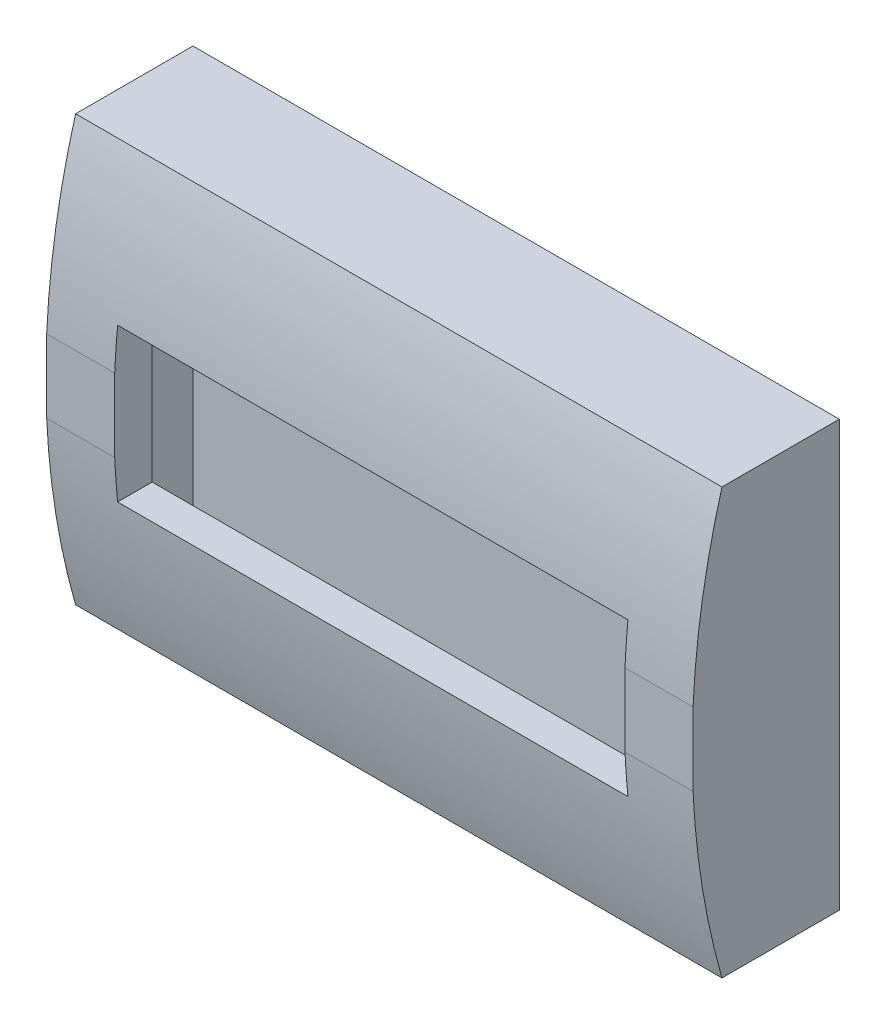
ISO-10303-21;
HEADER;
FILE_DESCRIPTION(('STEP AP214'),'2;1');
FILE_NAME('part.step','',(''),(''),'','','');
FILE_SCHEMA(('AUTOMOTIVE_DESIGN { 1 0 10303 214 1 1 1 1 }'));
ENDSEC;
DATA;
#1=APPLICATION_CONTEXT('core data for automotive mechanical design processes');
#2=APPLICATION_PROTOCOL_DEFINITION('international standard','automotive_design',2000,#1);
#3=PRODUCT_CONTEXT('',#1,'mechanical');
#4=PRODUCT('Part','Part','',(#3));
#5=PRODUCT_RELATED_PRODUCT_CATEGORY('part','',(#4));
#6=PRODUCT_DEFINITION_FORMATION('','',#4);
#7=PRODUCT_DEFINITION_CONTEXT('part definition',#1,'design');
#8=PRODUCT_DEFINITION('design','',#6,#7);
#9=PRODUCT_DEFINITION_SHAPE('','',#8);
#10=(LENGTH_UNIT() NAMED_UNIT(*) SI_UNIT(.MILLI.,.METRE.));
#11=(NAMED_UNIT(*) PLANE_ANGLE_UNIT() SI_UNIT($,.RADIAN.));
#12=(NAMED_UNIT(*) SI_UNIT($,.STERADIAN.) SOLID_ANGLE_UNIT());
#13=UNCERTAINTY_MEASURE_WITH_UNIT(LENGTH_MEASURE(1.E-05),#10,'distance_accuracy_value','');
#14=(GEOMETRIC_REPRESENTATION_CONTEXT(3) GLOBAL_UNCERTAINTY_ASSIGNED_CONTEXT((#13)) GLOBAL_UNIT_ASSIGNED_CONTEXT((#10,
#11,#12)) REPRESENTATION_CONTEXT('',''));
#15=CARTESIAN_POINT('',(0.,0.,0.));
#16=DIRECTION('',(0.,0.,1.));
#17=DIRECTION('',(1.,0.,0.));
#18=AXIS2_PLACEMENT_3D('',#15,#16,#17);
#19=CARTESIAN_POINT('',(150.,-45.,45.));
#20=DIRECTION('',(1.,0.,0.));
#21=DIRECTION('',(0.,0.,-1.));
#22=AXIS2_PLACEMENT_3D('',#19,#20,#21);
#23=PLANE('',#22);
#24=DIRECTION('',(0.,0.,1.));
#25=VECTOR('',#24,1.);
#26=CARTESIAN_POINT('',(150.,-45.,45.));
#27=LINE('',#26,#25);
#28=CARTESIAN_POINT('',(150.,-45.,64.));
#29=VERTEX_POINT('',#28);
#30=CARTESIAN_POINT('',(150.,-45.,84.277301057347));
#31=VERTEX_POINT('',#30);
#32=EDGE_CURVE('E215',#29,#31,#27,.T.);
#33=ORIENTED_EDGE('',*,*,#32,.T.);
#34=CARTESIAN_POINT('',(150.,0.,-368.466147398303));
#35=DIRECTION('',(1.,0.,0.));
#36=DIRECTION('',(0.,0.,-1.));
#37=AXIS2_PLACEMENT_3D('',#34,#35,#36);
#38=CIRCLE('',#37,454.97431808786);
#39=CARTESIAN_POINT('',(150.,-21.4976972826802,85.9999999999999));
#40=VERTEX_POINT('',#39);
#41=EDGE_CURVE('E267',#31,#40,#38,.F.);
#42=ORIENTED_EDGE('',*,*,#41,.T.);
#43=DIRECTION('',(0.,1.,0.));
#44=VECTOR('',#43,1.);
#45=CARTESIAN_POINT('',(150.,-45.,86.));
#46=LINE('',#45,#44);
#47=CARTESIAN_POINT('',(150.,21.4976972826789,86.));
#48=VERTEX_POINT('',#47);
#49=EDGE_CURVE('E272',#40,#48,#46,.T.);
#50=ORIENTED_EDGE('',*,*,#49,.T.);
#51=CARTESIAN_POINT('',(150.,45.,84.277301057347));
#52=VERTEX_POINT('',#51);
#53=EDGE_CURVE('E58',#48,#52,#38,.F.);
#54=ORIENTED_EDGE('',*,*,#53,.T.);
#55=DIRECTION('',(0.,0.,1.));
#56=VECTOR('',#55,1.);
#57=CARTESIAN_POINT('',(150.,45.,45.));
#58=LINE('',#57,#56);
#59=CARTESIAN_POINT('',(150.,45.,64.));
#60=VERTEX_POINT('',#59);
#61=EDGE_CURVE('E277',#60,#52,#58,.T.);
#62=ORIENTED_EDGE('',*,*,#61,.F.);
#63=DIRECTION('',(0.,1.,0.));
#64=VECTOR('',#63,1.);
#65=CARTESIAN_POINT('',(150.,0.,64.));
#66=LINE('',#65,#64);
#67=EDGE_CURVE('E188',#29,#60,#66,.T.);
#68=ORIENTED_EDGE('',*,*,#67,.F.);
#69=EDGE_LOOP('',(#33,#42,#50,#54,#62,#68));
#70=FACE_BOUND('',#69,.T.);
#71=ADVANCED_FACE('F35',(#70),#23,.F.);
#72=CARTESIAN_POINT('',(-150.,-45.,45.));
#73=DIRECTION('',(-1.,0.,0.));
#74=DIRECTION('',(0.,0.,1.));
#75=AXIS2_PLACEMENT_3D('',#72,#73,#74);
#76=PLANE('',#75);
#77=DIRECTION('',(0.,-1.,0.));
#78=VECTOR('',#77,1.);
#79=CARTESIAN_POINT('',(-150.,-45.,86.));
#80=LINE('',#79,#78);
#81=CARTESIAN_POINT('',(-150.,21.4976972826802,85.9999999999999));
#82=VERTEX_POINT('',#81);
#83=CARTESIAN_POINT('',(-150.,-21.4976972826789,86.));
#84=VERTEX_POINT('',#83);
#85=EDGE_CURVE('E274',#82,#84,#80,.T.);
#86=ORIENTED_EDGE('',*,*,#85,.T.);
#87=CARTESIAN_POINT('',(-150.,0.,-368.466147398303));
#88=DIRECTION('',(-1.,0.,0.));
#89=DIRECTION('',(0.,0.,1.));
#90=AXIS2_PLACEMENT_3D('',#87,#88,#89);
#91=CIRCLE('',#90,454.97431808786);
#92=CARTESIAN_POINT('',(-150.,-45.,84.277301057347));
#93=VERTEX_POINT('',#92);
#94=EDGE_CURVE('E50',#84,#93,#91,.F.);
#95=ORIENTED_EDGE('',*,*,#94,.T.);
#96=DIRECTION('',(0.,0.,1.));
#97=VECTOR('',#96,1.);
#98=CARTESIAN_POINT('',(-150.,-45.,45.));
#99=LINE('',#98,#97);
#100=CARTESIAN_POINT('',(-150.,-45.,64.));
#101=VERTEX_POINT('',#100);
#102=EDGE_CURVE('E280',#101,#93,#99,.T.);
#103=ORIENTED_EDGE('',*,*,#102,.F.);
#104=DIRECTION('',(0.,-1.,0.));
#105=VECTOR('',#104,1.);
#106=CARTESIAN_POINT('',(-150.,0.,64.));
#107=LINE('',#106,#105);
#108=CARTESIAN_POINT('',(-150.,45.,64.));
#109=VERTEX_POINT('',#108);
#110=EDGE_CURVE('E182',#109,#101,#107,.T.);
#111=ORIENTED_EDGE('',*,*,#110,.F.);
#112=DIRECTION('',(0.,0.,1.));
#113=VECTOR('',#112,1.);
#114=CARTESIAN_POINT('',(-150.,45.,45.));
#115=LINE('',#114,#113);
#116=CARTESIAN_POINT('',(-150.,45.,84.277301057347));
#117=VERTEX_POINT('',#116);
#118=EDGE_CURVE('E283',#109,#117,#115,.T.);
#119=ORIENTED_EDGE('',*,*,#118,.T.);
#120=EDGE_CURVE('E262',#117,#82,#91,.F.);
#121=ORIENTED_EDGE('',*,*,#120,.T.);
#122=EDGE_LOOP('',(#86,#95,#103,#111,#119,#121));
#123=FACE_BOUND('',#122,.T.);
#124=ADVANCED_FACE('F299',(#123),#76,.F.);
#125=CARTESIAN_POINT('',(190.,-125.,64.));
#126=DIRECTION('',(-1.,0.,0.));
#127=DIRECTION('',(0.,0.,1.));
#128=AXIS2_PLACEMENT_3D('',#125,#126,#127);
#129=PLANE('',#128);
#130=DIRECTION('',(0.,1.,0.));
#131=VECTOR('',#130,1.);
#132=CARTESIAN_POINT('',(190.,125.,86.));
#133=LINE('',#132,#131);
#134=CARTESIAN_POINT('',(190.,-21.4976972826789,86.));
#135=VERTEX_POINT('',#134);
#136=CARTESIAN_POINT('',(190.,21.4976972826789,86.));
#137=VERTEX_POINT('',#136);
#138=EDGE_CURVE('E204',#135,#137,#133,.T.);
#139=ORIENTED_EDGE('',*,*,#138,.F.);
#140=CARTESIAN_POINT('',(190.,0.,-368.466147398303));
#141=DIRECTION('',(-1.,0.,0.));
#142=DIRECTION('',(0.,0.,1.));
#143=AXIS2_PLACEMENT_3D('',#140,#141,#142);
#144=CIRCLE('',#143,454.97431808786);
#145=CARTESIAN_POINT('',(190.,-125.,69.));
#146=VERTEX_POINT('',#145);
#147=EDGE_CURVE('E206',#146,#135,#144,.T.);
#148=ORIENTED_EDGE('',*,*,#147,.F.);
#149=DIRECTION('',(0.,0.,-1.));
#150=VECTOR('',#149,1.);
#151=CARTESIAN_POINT('',(190.,-125.,64.));
#152=LINE('',#151,#150);
#153=CARTESIAN_POINT('',(190.,-125.,0.));
#154=VERTEX_POINT('',#153);
#155=EDGE_CURVE('E163',#146,#154,#152,.T.);
#156=ORIENTED_EDGE('',*,*,#155,.T.);
#157=DIRECTION('',(0.,1.,0.));
#158=VECTOR('',#157,1.);
#159=CARTESIAN_POINT('',(190.,-125.,0.));
#160=LINE('',#159,#158);
#161=CARTESIAN_POINT('',(190.,125.,0.));
#162=VERTEX_POINT('',#161);
#163=EDGE_CURVE('E243',#154,#162,#160,.T.);
#164=ORIENTED_EDGE('',*,*,#163,.T.);
#165=DIRECTION('',(0.,0.,-1.));
#166=VECTOR('',#165,1.);
#167=CARTESIAN_POINT('',(190.,125.,64.));
#168=LINE('',#167,#166);
#169=CARTESIAN_POINT('',(190.,125.,69.));
#170=VERTEX_POINT('',#169);
#171=EDGE_CURVE('E172',#170,#162,#168,.T.);
#172=ORIENTED_EDGE('',*,*,#171,.F.);
#173=EDGE_CURVE('E195',#137,#170,#144,.T.);
#174=ORIENTED_EDGE('',*,*,#173,.F.);
#175=EDGE_LOOP('',(#139,#148,#156,#164,#172,#174));
#176=FACE_BOUND('',#175,.T.);
#177=ADVANCED_FACE('F37',(#176),#129,.F.);
#178=CARTESIAN_POINT('',(-190.,-125.,64.));
#179=DIRECTION('',(1.,0.,0.));
#180=DIRECTION('',(0.,0.,-1.));
#181=AXIS2_PLACEMENT_3D('',#178,#179,#180);
#182=PLANE('',#181);
#183=DIRECTION('',(0.,0.,-1.));
#184=VECTOR('',#183,1.);
#185=CARTESIAN_POINT('',(-190.,-125.,64.));
#186=LINE('',#185,#184);
#187=CARTESIAN_POINT('',(-190.,-125.,69.));
#188=VERTEX_POINT('',#187);
#189=CARTESIAN_POINT('',(-190.,-125.,0.));
#190=VERTEX_POINT('',#189);
#191=EDGE_CURVE('E161',#188,#190,#186,.T.);
#192=ORIENTED_EDGE('',*,*,#191,.F.);
#193=CARTESIAN_POINT('',(-190.,0.,-368.466147398303));
#194=DIRECTION('',(1.,0.,0.));
#195=DIRECTION('',(0.,0.,1.));
#196=AXIS2_PLACEMENT_3D('',#193,#194,#195);
#197=CIRCLE('',#196,454.97431808786);
#198=CARTESIAN_POINT('',(-190.,-21.4976972826789,86.));
#199=VERTEX_POINT('',#198);
#200=EDGE_CURVE('E145',#199,#188,#197,.T.);
#201=ORIENTED_EDGE('',*,*,#200,.F.);
#202=DIRECTION('',(0.,-1.,0.));
#203=VECTOR('',#202,1.);
#204=CARTESIAN_POINT('',(-190.,125.,86.));
#205=LINE('',#204,#203);
#206=CARTESIAN_POINT('',(-190.,21.4976972826789,86.));
#207=VERTEX_POINT('',#206);
#208=EDGE_CURVE('E210',#207,#199,#205,.T.);
#209=ORIENTED_EDGE('',*,*,#208,.F.);
#210=CARTESIAN_POINT('',(-190.,125.,69.));
#211=VERTEX_POINT('',#210);
#212=EDGE_CURVE('E155',#211,#207,#197,.T.);
#213=ORIENTED_EDGE('',*,*,#212,.F.);
#214=DIRECTION('',(0.,0.,-1.));
#215=VECTOR('',#214,1.);
#216=CARTESIAN_POINT('',(-190.,125.,64.));
#217=LINE('',#216,#215);
#218=CARTESIAN_POINT('',(-190.,125.,0.));
#219=VERTEX_POINT('',#218);
#220=EDGE_CURVE('E170',#211,#219,#217,.T.);
#221=ORIENTED_EDGE('',*,*,#220,.T.);
#222=DIRECTION('',(0.,-1.,0.));
#223=VECTOR('',#222,1.);
#224=CARTESIAN_POINT('',(-190.,-125.,0.));
#225=LINE('',#224,#223);
#226=EDGE_CURVE('E168',#219,#190,#225,.T.);
#227=ORIENTED_EDGE('',*,*,#226,.T.);
#228=EDGE_LOOP('',(#192,#201,#209,#213,#221,#227));
#229=FACE_BOUND('',#228,.T.);
#230=ADVANCED_FACE('F166',(#229),#182,.F.);
#231=CARTESIAN_POINT('',(0.,0.,86.));
#232=DIRECTION('',(0.,0.,1.));
#233=DIRECTION('',(1.,0.,0.));
#234=AXIS2_PLACEMENT_3D('',#231,#232,#233);
#235=PLANE('',#234);
#236=DIRECTION('',(-1.,0.,0.));
#237=VECTOR('',#236,1.);
#238=CARTESIAN_POINT('',(504.265925623486,21.4976972826789,86.));
#239=LINE('',#238,#237);
#240=EDGE_CURVE('E11',#207,#82,#239,.F.);
#241=ORIENTED_EDGE('',*,*,#240,.F.);
#242=ORIENTED_EDGE('',*,*,#208,.T.);
#243=DIRECTION('',(-1.,0.,0.));
#244=VECTOR('',#243,1.);
#245=CARTESIAN_POINT('',(504.265925623486,-21.4976972826789,86.));
#246=LINE('',#245,#244);
#247=EDGE_CURVE('E150',#84,#199,#246,.T.);
#248=ORIENTED_EDGE('',*,*,#247,.F.);
#249=ORIENTED_EDGE('',*,*,#85,.F.);
#250=EDGE_LOOP('',(#241,#242,#248,#249));
#251=FACE_BOUND('',#250,.T.);
#252=ADVANCED_FACE('F304',(#251),#235,.T.);
#253=CARTESIAN_POINT('',(0.,0.,4.));
#254=DIRECTION('',(0.,0.,-1.));
#255=DIRECTION('',(-1.,0.,0.));
#256=AXIS2_PLACEMENT_3D('',#253,#254,#255);
#257=PLANE('',#256);
#258=DIRECTION('',(0.,1.,0.));
#259=VECTOR('',#258,1.);
#260=CARTESIAN_POINT('',(186.,-121.,4.));
#261=LINE('',#260,#259);
#262=CARTESIAN_POINT('',(186.,-121.,4.));
#263=VERTEX_POINT('',#262);
#264=CARTESIAN_POINT('',(186.,121.,4.));
#265=VERTEX_POINT('',#264);
#266=EDGE_CURVE('E219',#263,#265,#261,.T.);
#267=ORIENTED_EDGE('',*,*,#266,.T.);
#268=DIRECTION('',(-1.,0.,0.));
#269=VECTOR('',#268,1.);
#270=CARTESIAN_POINT('',(-186.,121.,4.));
#271=LINE('',#270,#269);
#272=CARTESIAN_POINT('',(-186.,121.,4.));
#273=VERTEX_POINT('',#272);
#274=EDGE_CURVE('E222',#265,#273,#271,.T.);
#275=ORIENTED_EDGE('',*,*,#274,.T.);
#276=DIRECTION('',(0.,-1.,0.));
#277=VECTOR('',#276,1.);
#278=CARTESIAN_POINT('',(-186.,-121.,4.));
#279=LINE('',#278,#277);
#280=CARTESIAN_POINT('',(-186.,-121.,4.));
#281=VERTEX_POINT('',#280);
#282=EDGE_CURVE('E226',#273,#281,#279,.T.);
#283=ORIENTED_EDGE('',*,*,#282,.T.);
#284=DIRECTION('',(1.,0.,0.));
#285=VECTOR('',#284,1.);
#286=CARTESIAN_POINT('',(-186.,-121.,4.));
#287=LINE('',#286,#285);
#288=EDGE_CURVE('E229',#281,#263,#287,.T.);
#289=ORIENTED_EDGE('',*,*,#288,.T.);
#290=EDGE_LOOP('',(#267,#275,#283,#289));
#291=FACE_BOUND('',#290,.T.);
#292=ADVANCED_FACE('F329',(#291),#257,.F.);
#293=CARTESIAN_POINT('',(-186.,121.,4.));
#294=DIRECTION('',(0.,1.,0.));
#295=DIRECTION('',(0.,0.,1.));
#296=AXIS2_PLACEMENT_3D('',#293,#294,#295);
#297=PLANE('',#296);
#298=DIRECTION('',(-1.,0.,0.));
#299=VECTOR('',#298,1.);
#300=CARTESIAN_POINT('',(-186.,121.,64.));
#301=LINE('',#300,#299);
#302=CARTESIAN_POINT('',(186.,121.,64.));
#303=VERTEX_POINT('',#302);
#304=CARTESIAN_POINT('',(-186.,121.,64.));
#305=VERTEX_POINT('',#304);
#306=EDGE_CURVE('E213',#303,#305,#301,.T.);
#307=ORIENTED_EDGE('',*,*,#306,.T.);
#308=DIRECTION('',(0.,0.,1.));
#309=VECTOR('',#308,1.);
#310=CARTESIAN_POINT('',(-186.,121.,4.));
#311=LINE('',#310,#309);
#312=EDGE_CURVE('E247',#273,#305,#311,.T.);
#313=ORIENTED_EDGE('',*,*,#312,.F.);
#314=ORIENTED_EDGE('',*,*,#274,.F.);
#315=DIRECTION('',(0.,0.,1.));
#316=VECTOR('',#315,1.);
#317=CARTESIAN_POINT('',(186.,121.,4.));
#318=LINE('',#317,#316);
#319=EDGE_CURVE('E231',#265,#303,#318,.T.);
#320=ORIENTED_EDGE('',*,*,#319,.T.);
#321=EDGE_LOOP('',(#307,#313,#314,#320));
#322=FACE_BOUND('',#321,.T.);
#323=ADVANCED_FACE('F332',(#322),#297,.F.);
#324=CARTESIAN_POINT('',(-186.,-121.,4.));
#325=DIRECTION('',(-1.,0.,0.));
#326=DIRECTION('',(0.,0.,1.));
#327=AXIS2_PLACEMENT_3D('',#324,#325,#326);
#328=PLANE('',#327);
#329=DIRECTION('',(0.,-1.,0.));
#330=VECTOR('',#329,1.);
#331=CARTESIAN_POINT('',(-186.,-121.,64.));
#332=LINE('',#331,#330);
#333=CARTESIAN_POINT('',(-186.,-121.,64.));
#334=VERTEX_POINT('',#333);
#335=EDGE_CURVE('E235',#305,#334,#332,.T.);
#336=ORIENTED_EDGE('',*,*,#335,.T.);
#337=DIRECTION('',(0.,0.,1.));
#338=VECTOR('',#337,1.);
#339=CARTESIAN_POINT('',(-186.,-121.,4.));
#340=LINE('',#339,#338);
#341=EDGE_CURVE('E244',#281,#334,#340,.T.);
#342=ORIENTED_EDGE('',*,*,#341,.F.);
#343=ORIENTED_EDGE('',*,*,#282,.F.);
#344=ORIENTED_EDGE('',*,*,#312,.T.);
#345=EDGE_LOOP('',(#336,#342,#343,#344));
#346=FACE_BOUND('',#345,.T.);
#347=ADVANCED_FACE('F337',(#346),#328,.F.);
#348=CARTESIAN_POINT('',(-186.,-121.,4.));
#349=DIRECTION('',(0.,-1.,0.));
#350=DIRECTION('',(0.,0.,-1.));
#351=AXIS2_PLACEMENT_3D('',#348,#349,#350);
#352=PLANE('',#351);
#353=DIRECTION('',(1.,0.,0.));
#354=VECTOR('',#353,1.);
#355=CARTESIAN_POINT('',(-186.,-121.,64.));
#356=LINE('',#355,#354);
#357=CARTESIAN_POINT('',(186.,-121.,64.));
#358=VERTEX_POINT('',#357);
#359=EDGE_CURVE('E223',#334,#358,#356,.T.);
#360=ORIENTED_EDGE('',*,*,#359,.T.);
#361=DIRECTION('',(0.,0.,1.));
#362=VECTOR('',#361,1.);
#363=CARTESIAN_POINT('',(186.,-121.,4.));
#364=LINE('',#363,#362);
#365=EDGE_CURVE('E240',#263,#358,#364,.T.);
#366=ORIENTED_EDGE('',*,*,#365,.F.);
#367=ORIENTED_EDGE('',*,*,#288,.F.);
#368=ORIENTED_EDGE('',*,*,#341,.T.);
#369=EDGE_LOOP('',(#360,#366,#367,#368));
#370=FACE_BOUND('',#369,.T.);
#371=ADVANCED_FACE('F334',(#370),#352,.F.);
#372=CARTESIAN_POINT('',(186.,-121.,4.));
#373=DIRECTION('',(1.,0.,0.));
#374=DIRECTION('',(0.,0.,-1.));
#375=AXIS2_PLACEMENT_3D('',#372,#373,#374);
#376=PLANE('',#375);
#377=DIRECTION('',(0.,1.,0.));
#378=VECTOR('',#377,1.);
#379=CARTESIAN_POINT('',(186.,-121.,64.));
#380=LINE('',#379,#378);
#381=EDGE_CURVE('E209',#358,#303,#380,.T.);
#382=ORIENTED_EDGE('',*,*,#381,.T.);
#383=ORIENTED_EDGE('',*,*,#319,.F.);
#384=ORIENTED_EDGE('',*,*,#266,.F.);
#385=ORIENTED_EDGE('',*,*,#365,.T.);
#386=EDGE_LOOP('',(#382,#383,#384,#385));
#387=FACE_BOUND('',#386,.T.);
#388=ADVANCED_FACE('F328',(#387),#376,.F.);
#389=CARTESIAN_POINT('',(0.,0.,64.));
#390=DIRECTION('',(0.,0.,1.));
#391=DIRECTION('',(1.,0.,0.));
#392=AXIS2_PLACEMENT_3D('',#389,#390,#391);
#393=PLANE('',#392);
#394=DIRECTION('',(1.,0.,0.));
#395=VECTOR('',#394,1.);
#396=CARTESIAN_POINT('',(0.,-45.,64.));
#397=LINE('',#396,#395);
#398=EDGE_CURVE('E185',#101,#29,#397,.T.);
#399=ORIENTED_EDGE('',*,*,#398,.T.);
#400=ORIENTED_EDGE('',*,*,#67,.T.);
#401=DIRECTION('',(-1.,0.,0.));
#402=VECTOR('',#401,1.);
#403=CARTESIAN_POINT('',(0.,45.,64.));
#404=LINE('',#403,#402);
#405=EDGE_CURVE('E179',#60,#109,#404,.T.);
#406=ORIENTED_EDGE('',*,*,#405,.T.);
#407=ORIENTED_EDGE('',*,*,#110,.T.);
#408=EDGE_LOOP('',(#399,#400,#406,#407));
#409=FACE_BOUND('',#408,.T.);
#410=ORIENTED_EDGE('',*,*,#306,.F.);
#411=ORIENTED_EDGE('',*,*,#381,.F.);
#412=ORIENTED_EDGE('',*,*,#359,.F.);
#413=ORIENTED_EDGE('',*,*,#335,.F.);
#414=EDGE_LOOP('',(#410,#411,#412,#413));
#415=FACE_BOUND('',#414,.T.);
#416=ADVANCED_FACE('F292',(#409,#415),#393,.F.);
#417=CARTESIAN_POINT('',(-150.,-45.,45.));
#418=DIRECTION('',(0.,-1.,0.));
#419=DIRECTION('',(0.,0.,-1.));
#420=AXIS2_PLACEMENT_3D('',#417,#418,#419);
#421=PLANE('',#420);
#422=ORIENTED_EDGE('',*,*,#102,.T.);
#423=DIRECTION('',(-1.,0.,0.));
#424=VECTOR('',#423,1.);
#425=CARTESIAN_POINT('',(504.265925623486,-45.,84.277301057347));
#426=LINE('',#425,#424);
#427=EDGE_CURVE('E260',#93,#31,#426,.F.);
#428=ORIENTED_EDGE('',*,*,#427,.T.);
#429=ORIENTED_EDGE('',*,*,#32,.F.);
#430=ORIENTED_EDGE('',*,*,#398,.F.);
#431=EDGE_LOOP('',(#422,#428,#429,#430));
#432=FACE_BOUND('',#431,.T.);
#433=ADVANCED_FACE('F297',(#432),#421,.F.);
#434=CARTESIAN_POINT('',(-150.,45.,45.));
#435=DIRECTION('',(0.,1.,0.));
#436=DIRECTION('',(0.,0.,1.));
#437=AXIS2_PLACEMENT_3D('',#434,#435,#436);
#438=PLANE('',#437);
#439=ORIENTED_EDGE('',*,*,#61,.T.);
#440=DIRECTION('',(-1.,0.,0.));
#441=VECTOR('',#440,1.);
#442=CARTESIAN_POINT('',(504.265925623486,45.,84.277301057347));
#443=LINE('',#442,#441);
#444=EDGE_CURVE('E269',#52,#117,#443,.T.);
#445=ORIENTED_EDGE('',*,*,#444,.T.);
#446=ORIENTED_EDGE('',*,*,#118,.F.);
#447=ORIENTED_EDGE('',*,*,#405,.F.);
#448=EDGE_LOOP('',(#439,#445,#446,#447));
#449=FACE_BOUND('',#448,.T.);
#450=ADVANCED_FACE('F288',(#449),#438,.F.);
#451=CARTESIAN_POINT('',(-190.,125.,64.));
#452=DIRECTION('',(0.,-1.,0.));
#453=DIRECTION('',(0.,0.,-1.));
#454=AXIS2_PLACEMENT_3D('',#451,#452,#453);
#455=PLANE('',#454);
#456=ORIENTED_EDGE('',*,*,#220,.F.);
#457=DIRECTION('',(-1.,0.,0.));
#458=VECTOR('',#457,1.);
#459=CARTESIAN_POINT('',(504.265925623486,125.,69.));
#460=LINE('',#459,#458);
#461=EDGE_CURVE('E164',#170,#211,#460,.T.);
#462=ORIENTED_EDGE('',*,*,#461,.F.);
#463=ORIENTED_EDGE('',*,*,#171,.T.);
#464=DIRECTION('',(-1.,0.,0.));
#465=VECTOR('',#464,1.);
#466=CARTESIAN_POINT('',(-190.,125.,0.));
#467=LINE('',#466,#465);
#468=EDGE_CURVE('E253',#162,#219,#467,.T.);
#469=ORIENTED_EDGE('',*,*,#468,.T.);
#470=EDGE_LOOP('',(#456,#462,#463,#469));
#471=FACE_BOUND('',#470,.T.);
#472=ADVANCED_FACE('F308',(#471),#455,.F.);
#473=CARTESIAN_POINT('',(-190.,-125.,64.));
#474=DIRECTION('',(0.,1.,0.));
#475=DIRECTION('',(0.,0.,1.));
#476=AXIS2_PLACEMENT_3D('',#473,#474,#475);
#477=PLANE('',#476);
#478=ORIENTED_EDGE('',*,*,#155,.F.);
#479=DIRECTION('',(-1.,0.,0.));
#480=VECTOR('',#479,1.);
#481=CARTESIAN_POINT('',(504.265925623486,-125.,69.));
#482=LINE('',#481,#480);
#483=EDGE_CURVE('E148',#146,#188,#482,.T.);
#484=ORIENTED_EDGE('',*,*,#483,.T.);
#485=ORIENTED_EDGE('',*,*,#191,.T.);
#486=DIRECTION('',(1.,0.,0.));
#487=VECTOR('',#486,1.);
#488=CARTESIAN_POINT('',(-190.,-125.,0.));
#489=LINE('',#488,#487);
#490=EDGE_CURVE('E174',#190,#154,#489,.T.);
#491=ORIENTED_EDGE('',*,*,#490,.T.);
#492=EDGE_LOOP('',(#478,#484,#485,#491));
#493=FACE_BOUND('',#492,.T.);
#494=ADVANCED_FACE('F159',(#493),#477,.F.);
#495=CARTESIAN_POINT('',(0.,0.,0.));
#496=DIRECTION('',(0.,0.,-1.));
#497=DIRECTION('',(-1.,0.,0.));
#498=AXIS2_PLACEMENT_3D('',#495,#496,#497);
#499=PLANE('',#498);
#500=ORIENTED_EDGE('',*,*,#163,.F.);
#501=ORIENTED_EDGE('',*,*,#490,.F.);
#502=ORIENTED_EDGE('',*,*,#226,.F.);
#503=ORIENTED_EDGE('',*,*,#468,.F.);
#504=EDGE_LOOP('',(#500,#501,#502,#503));
#505=FACE_BOUND('',#504,.T.);
#506=ADVANCED_FACE('F259',(#505),#499,.T.);
#507=EDGE_CURVE('E39',#48,#137,#239,.F.);
#508=ORIENTED_EDGE('',*,*,#507,.F.);
#509=ORIENTED_EDGE('',*,*,#49,.F.);
#510=EDGE_CURVE('E190',#135,#40,#246,.T.);
#511=ORIENTED_EDGE('',*,*,#510,.F.);
#512=ORIENTED_EDGE('',*,*,#138,.T.);
#513=EDGE_LOOP('',(#508,#509,#511,#512));
#514=FACE_BOUND('',#513,.T.);
#515=ADVANCED_FACE('F208',(#514),#235,.T.);
#516=CARTESIAN_POINT('',(504.265925623486,0.,-368.466147398303));
#517=DIRECTION('',(-1.,0.,0.));
#518=DIRECTION('',(0.,0.,1.));
#519=AXIS2_PLACEMENT_3D('',#516,#517,#518);
#520=CYLINDRICAL_SURFACE('',#519,454.97431808786);
#521=ORIENTED_EDGE('',*,*,#510,.T.);
#522=ORIENTED_EDGE('',*,*,#41,.F.);
#523=ORIENTED_EDGE('',*,*,#427,.F.);
#524=ORIENTED_EDGE('',*,*,#94,.F.);
#525=ORIENTED_EDGE('',*,*,#247,.T.);
#526=ORIENTED_EDGE('',*,*,#200,.T.);
#527=ORIENTED_EDGE('',*,*,#483,.F.);
#528=ORIENTED_EDGE('',*,*,#147,.T.);
#529=EDGE_LOOP('',(#521,#522,#523,#524,#525,#526,#527,#528));
#530=FACE_BOUND('',#529,.T.);
#531=ADVANCED_FACE('F147',(#530),#520,.T.);
#532=ORIENTED_EDGE('',*,*,#240,.T.);
#533=ORIENTED_EDGE('',*,*,#120,.F.);
#534=ORIENTED_EDGE('',*,*,#444,.F.);
#535=ORIENTED_EDGE('',*,*,#53,.F.);
#536=ORIENTED_EDGE('',*,*,#507,.T.);
#537=ORIENTED_EDGE('',*,*,#173,.T.);
#538=ORIENTED_EDGE('',*,*,#461,.T.);
#539=ORIENTED_EDGE('',*,*,#212,.T.);
#540=EDGE_LOOP('',(#532,#533,#534,#535,#536,#537,#538,#539));
#541=FACE_BOUND('',#540,.T.);
#542=ADVANCED_FACE('F194',(#541),#520,.T.);
#543=CLOSED_SHELL('',(#71,#124,#177,#230,#252,#292,#323,#347,#371,#388,#416,#433,#450,#472,#494,
#506,#515,#531,#542));
#544=MANIFOLD_SOLID_BREP('B2',#543);
#545=ADVANCED_BREP_SHAPE_REPRESENTATION('',(#18,#544),#14);
#546=SHAPE_DEFINITION_REPRESENTATION(#9,#545);
ENDSEC;
END-ISO-10303-21;
